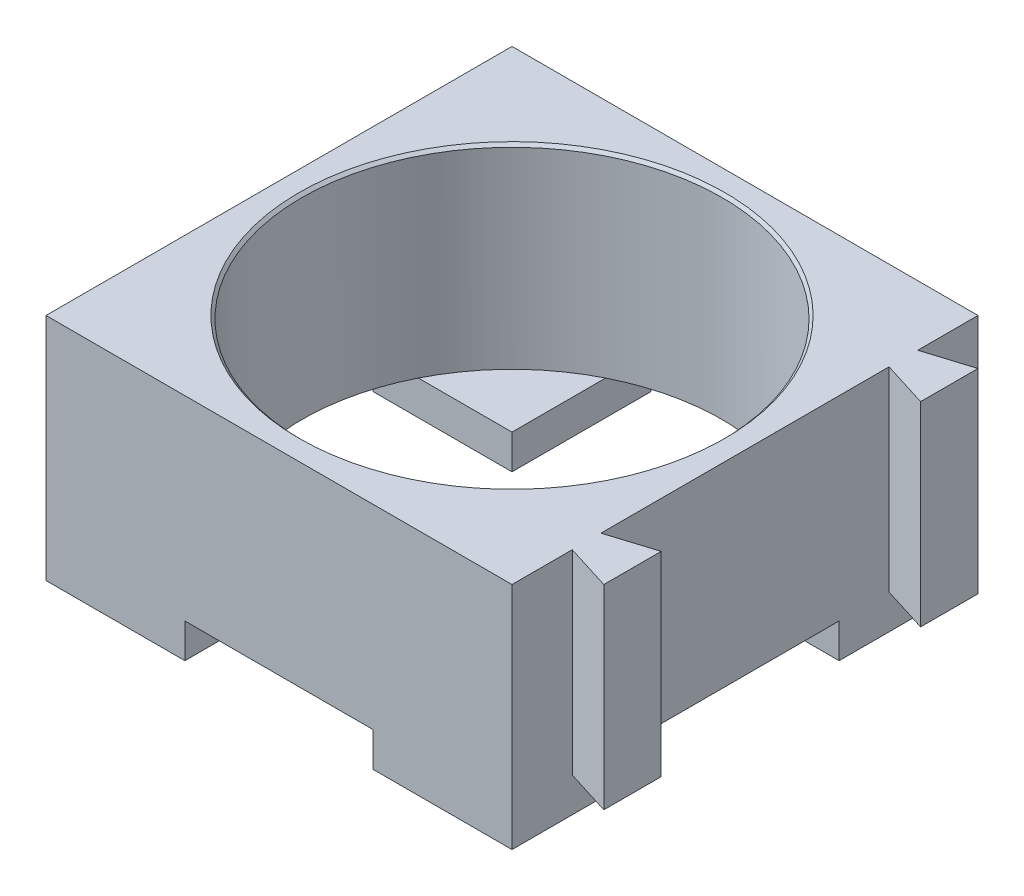
ISO-10303-21;
HEADER;
FILE_DESCRIPTION(('STEP AP214'),'2;1');
FILE_NAME('part.step','',(''),(''),'','','');
FILE_SCHEMA(('AUTOMOTIVE_DESIGN { 1 0 10303 214 1 1 1 1 }'));
ENDSEC;
DATA;
#1=APPLICATION_CONTEXT('core data for automotive mechanical design processes');
#2=APPLICATION_PROTOCOL_DEFINITION('international standard','automotive_design',2000,#1);
#3=PRODUCT_CONTEXT('',#1,'mechanical');
#4=PRODUCT('Part','Part','',(#3));
#5=PRODUCT_RELATED_PRODUCT_CATEGORY('part','',(#4));
#6=PRODUCT_DEFINITION_FORMATION('','',#4);
#7=PRODUCT_DEFINITION_CONTEXT('part definition',#1,'design');
#8=PRODUCT_DEFINITION('design','',#6,#7);
#9=PRODUCT_DEFINITION_SHAPE('','',#8);
#10=(LENGTH_UNIT() NAMED_UNIT(*) SI_UNIT(.MILLI.,.METRE.));
#11=(NAMED_UNIT(*) PLANE_ANGLE_UNIT() SI_UNIT($,.RADIAN.));
#12=(NAMED_UNIT(*) SI_UNIT($,.STERADIAN.) SOLID_ANGLE_UNIT());
#13=UNCERTAINTY_MEASURE_WITH_UNIT(LENGTH_MEASURE(1.E-05),#10,'distance_accuracy_value','');
#14=(GEOMETRIC_REPRESENTATION_CONTEXT(3) GLOBAL_UNCERTAINTY_ASSIGNED_CONTEXT((#13)) GLOBAL_UNIT_ASSIGNED_CONTEXT((#10,
#11,#12)) REPRESENTATION_CONTEXT('',''));
#15=CARTESIAN_POINT('',(0.,0.,0.));
#16=DIRECTION('',(0.,0.,1.));
#17=DIRECTION('',(1.,0.,0.));
#18=AXIS2_PLACEMENT_3D('',#15,#16,#17);
#19=CARTESIAN_POINT('',(0.,0.,0.));
#20=DIRECTION('',(0.,1.,0.));
#21=DIRECTION('',(0.,0.,1.));
#22=AXIS2_PLACEMENT_3D('',#19,#20,#21);
#23=PLANE('',#22);
#24=DIRECTION('',(0.,0.,1.));
#25=VECTOR('',#24,1.);
#26=CARTESIAN_POINT('',(10.15,0.,-10.15));
#27=LINE('',#26,#25);
#28=CARTESIAN_POINT('',(10.15,0.,-7.525));
#29=VERTEX_POINT('',#28);
#30=CARTESIAN_POINT('',(10.15,0.,-6.275));
#31=VERTEX_POINT('',#30);
#32=EDGE_CURVE('E492',#29,#31,#27,.T.);
#33=ORIENTED_EDGE('',*,*,#32,.F.);
#34=DIRECTION('',(-0.954479978035031,0.,0.298274993135942));
#35=VECTOR('',#34,1.);
#36=CARTESIAN_POINT('',(12.15,0.,-8.15));
#37=LINE('',#36,#35);
#38=CARTESIAN_POINT('',(12.15,0.,-8.15));
#39=VERTEX_POINT('',#38);
#40=EDGE_CURVE('E379',#39,#29,#37,.T.);
#41=ORIENTED_EDGE('',*,*,#40,.F.);
#42=DIRECTION('',(0.,0.,-1.));
#43=VECTOR('',#42,1.);
#44=CARTESIAN_POINT('',(12.15,0.,-8.15));
#45=LINE('',#44,#43);
#46=CARTESIAN_POINT('',(12.15,0.,-5.65));
#47=VERTEX_POINT('',#46);
#48=EDGE_CURVE('E377',#47,#39,#45,.T.);
#49=ORIENTED_EDGE('',*,*,#48,.F.);
#50=DIRECTION('',(0.954479978035029,0.,0.298274993135948));
#51=VECTOR('',#50,1.);
#52=CARTESIAN_POINT('',(12.15,0.,-5.65));
#53=LINE('',#52,#51);
#54=EDGE_CURVE('E375',#31,#47,#53,.T.);
#55=ORIENTED_EDGE('',*,*,#54,.F.);
#56=EDGE_LOOP('',(#33,#41,#49,#55));
#57=FACE_BOUND('',#56,.T.);
#58=ADVANCED_FACE('F36',(#57),#23,.F.);
#59=DIRECTION('',(-1.,0.,0.));
#60=VECTOR('',#59,1.);
#61=CARTESIAN_POINT('',(10.15,0.,-4.1));
#62=LINE('',#61,#60);
#63=CARTESIAN_POINT('',(10.15,0.,-4.1));
#64=VERTEX_POINT('',#63);
#65=CARTESIAN_POINT('',(8.18000611246715,0.,-4.1));
#66=VERTEX_POINT('',#65);
#67=EDGE_CURVE('E51',#64,#66,#62,.T.);
#68=ORIENTED_EDGE('',*,*,#67,.F.);
#69=DIRECTION('',(0.,0.,-1.));
#70=VECTOR('',#69,1.);
#71=CARTESIAN_POINT('',(10.15,0.,-6.275));
#72=LINE('',#71,#70);
#73=CARTESIAN_POINT('',(10.15,0.,4.1));
#74=VERTEX_POINT('',#73);
#75=EDGE_CURVE('E247',#74,#64,#72,.T.);
#76=ORIENTED_EDGE('',*,*,#75,.F.);
#77=DIRECTION('',(1.,0.,0.));
#78=VECTOR('',#77,1.);
#79=CARTESIAN_POINT('',(10.15,0.,4.1));
#80=LINE('',#79,#78);
#81=CARTESIAN_POINT('',(8.18000611246715,0.,4.1));
#82=VERTEX_POINT('',#81);
#83=EDGE_CURVE('E271',#82,#74,#80,.T.);
#84=ORIENTED_EDGE('',*,*,#83,.F.);
#85=CARTESIAN_POINT('',(0.,0.,0.));
#86=DIRECTION('',(0.,1.,0.));
#87=DIRECTION('',(0.,0.,1.));
#88=AXIS2_PLACEMENT_3D('',#85,#86,#87);
#89=CIRCLE('',#88,9.14999999999999);
#90=EDGE_CURVE('E456',#82,#66,#89,.T.);
#91=ORIENTED_EDGE('',*,*,#90,.T.);
#92=EDGE_LOOP('',(#68,#76,#84,#91));
#93=FACE_BOUND('',#92,.T.);
#94=ADVANCED_FACE('F488',(#93),#23,.F.);
#95=DIRECTION('',(0.,0.,-1.));
#96=VECTOR('',#95,1.);
#97=CARTESIAN_POINT('',(4.1,0.,-10.15));
#98=LINE('',#97,#96);
#99=CARTESIAN_POINT('',(4.1,0.,-8.18000611246714));
#100=VERTEX_POINT('',#99);
#101=CARTESIAN_POINT('',(4.1,0.,-10.15));
#102=VERTEX_POINT('',#101);
#103=EDGE_CURVE('E481',#100,#102,#98,.T.);
#104=ORIENTED_EDGE('',*,*,#103,.F.);
#105=CARTESIAN_POINT('',(-4.1,0.,-8.18000611246715));
#106=VERTEX_POINT('',#105);
#107=EDGE_CURVE('E340',#100,#106,#89,.T.);
#108=ORIENTED_EDGE('',*,*,#107,.T.);
#109=DIRECTION('',(0.,0.,1.));
#110=VECTOR('',#109,1.);
#111=CARTESIAN_POINT('',(-4.1,0.,-10.15));
#112=LINE('',#111,#110);
#113=CARTESIAN_POINT('',(-4.1,0.,-10.15));
#114=VERTEX_POINT('',#113);
#115=EDGE_CURVE('E293',#114,#106,#112,.T.);
#116=ORIENTED_EDGE('',*,*,#115,.F.);
#117=DIRECTION('',(-1.,0.,0.));
#118=VECTOR('',#117,1.);
#119=CARTESIAN_POINT('',(-10.15,0.,-10.15));
#120=LINE('',#119,#118);
#121=EDGE_CURVE('E59',#102,#114,#120,.T.);
#122=ORIENTED_EDGE('',*,*,#121,.F.);
#123=EDGE_LOOP('',(#104,#108,#116,#122));
#124=FACE_BOUND('',#123,.T.);
#125=ADVANCED_FACE('F480',(#124),#23,.F.);
#126=DIRECTION('',(0.,0.,1.));
#127=VECTOR('',#126,1.);
#128=CARTESIAN_POINT('',(10.15,0.,10.15));
#129=LINE('',#128,#127);
#130=CARTESIAN_POINT('',(10.15,0.,6.275));
#131=VERTEX_POINT('',#130);
#132=CARTESIAN_POINT('',(10.15,0.,7.525));
#133=VERTEX_POINT('',#132);
#134=EDGE_CURVE('E248',#131,#133,#129,.T.);
#135=ORIENTED_EDGE('',*,*,#134,.F.);
#136=DIRECTION('',(-0.954479978035036,0.,0.298274993135925));
#137=VECTOR('',#136,1.);
#138=CARTESIAN_POINT('',(12.1500000000001,0.,5.65));
#139=LINE('',#138,#137);
#140=CARTESIAN_POINT('',(12.1500000000001,0.,5.65));
#141=VERTEX_POINT('',#140);
#142=EDGE_CURVE('E371',#141,#131,#139,.T.);
#143=ORIENTED_EDGE('',*,*,#142,.F.);
#144=DIRECTION('',(0.,0.,-1.));
#145=VECTOR('',#144,1.);
#146=CARTESIAN_POINT('',(12.1500000000001,0.,5.65));
#147=LINE('',#146,#145);
#148=CARTESIAN_POINT('',(12.15,0.,8.15000000000001));
#149=VERTEX_POINT('',#148);
#150=EDGE_CURVE('E369',#149,#141,#147,.T.);
#151=ORIENTED_EDGE('',*,*,#150,.F.);
#152=DIRECTION('',(0.954479978035028,0.,0.298274993135951));
#153=VECTOR('',#152,1.);
#154=CARTESIAN_POINT('',(12.15,0.,8.15000000000001));
#155=LINE('',#154,#153);
#156=EDGE_CURVE('E338',#133,#149,#155,.T.);
#157=ORIENTED_EDGE('',*,*,#156,.F.);
#158=EDGE_LOOP('',(#135,#143,#151,#157));
#159=FACE_BOUND('',#158,.T.);
#160=ADVANCED_FACE('F535',(#159),#23,.F.);
#161=DIRECTION('',(0.,0.,-1.));
#162=VECTOR('',#161,1.);
#163=CARTESIAN_POINT('',(4.1,0.,10.15));
#164=LINE('',#163,#162);
#165=CARTESIAN_POINT('',(4.1,0.,10.15));
#166=VERTEX_POINT('',#165);
#167=CARTESIAN_POINT('',(4.1,0.,8.18000611246715));
#168=VERTEX_POINT('',#167);
#169=EDGE_CURVE('E268',#166,#168,#164,.T.);
#170=ORIENTED_EDGE('',*,*,#169,.F.);
#171=DIRECTION('',(1.,0.,0.));
#172=VECTOR('',#171,1.);
#173=CARTESIAN_POINT('',(-10.15,0.,10.15));
#174=LINE('',#173,#172);
#175=CARTESIAN_POINT('',(-4.1,0.,10.15));
#176=VERTEX_POINT('',#175);
#177=EDGE_CURVE('E345',#176,#166,#174,.T.);
#178=ORIENTED_EDGE('',*,*,#177,.F.);
#179=DIRECTION('',(0.,0.,1.));
#180=VECTOR('',#179,1.);
#181=CARTESIAN_POINT('',(-4.1,0.,10.15));
#182=LINE('',#181,#180);
#183=CARTESIAN_POINT('',(-4.1,0.,8.18000611246714));
#184=VERTEX_POINT('',#183);
#185=EDGE_CURVE('E325',#184,#176,#182,.T.);
#186=ORIENTED_EDGE('',*,*,#185,.F.);
#187=EDGE_CURVE('E339',#184,#168,#89,.T.);
#188=ORIENTED_EDGE('',*,*,#187,.T.);
#189=EDGE_LOOP('',(#170,#178,#186,#188));
#190=FACE_BOUND('',#189,.T.);
#191=ADVANCED_FACE('F556',(#190),#23,.F.);
#192=DIRECTION('',(-1.,0.,0.));
#193=VECTOR('',#192,1.);
#194=CARTESIAN_POINT('',(-10.15,0.,-4.1));
#195=LINE('',#194,#193);
#196=CARTESIAN_POINT('',(-8.18000611246715,0.,-4.1));
#197=VERTEX_POINT('',#196);
#198=CARTESIAN_POINT('',(-10.15,0.,-4.1));
#199=VERTEX_POINT('',#198);
#200=EDGE_CURVE('E296',#197,#199,#195,.T.);
#201=ORIENTED_EDGE('',*,*,#200,.F.);
#202=CARTESIAN_POINT('',(-8.18000611246715,0.,4.1));
#203=VERTEX_POINT('',#202);
#204=EDGE_CURVE('E334',#197,#203,#89,.T.);
#205=ORIENTED_EDGE('',*,*,#204,.T.);
#206=DIRECTION('',(1.,0.,0.));
#207=VECTOR('',#206,1.);
#208=CARTESIAN_POINT('',(-10.15,0.,4.1));
#209=LINE('',#208,#207);
#210=CARTESIAN_POINT('',(-10.15,0.,4.1));
#211=VERTEX_POINT('',#210);
#212=EDGE_CURVE('E320',#211,#203,#209,.T.);
#213=ORIENTED_EDGE('',*,*,#212,.F.);
#214=DIRECTION('',(0.,0.,1.));
#215=VECTOR('',#214,1.);
#216=CARTESIAN_POINT('',(-10.15,0.,-10.15));
#217=LINE('',#216,#215);
#218=EDGE_CURVE('E383',#199,#211,#217,.T.);
#219=ORIENTED_EDGE('',*,*,#218,.F.);
#220=EDGE_LOOP('',(#201,#205,#213,#219));
#221=FACE_BOUND('',#220,.T.);
#222=ADVANCED_FACE('F463',(#221),#23,.F.);
#223=CARTESIAN_POINT('',(0.,8.5,0.));
#224=DIRECTION('',(0.,1.,0.));
#225=DIRECTION('',(0.,0.,1.));
#226=AXIS2_PLACEMENT_3D('',#223,#224,#225);
#227=PLANE('',#226);
#228=CARTESIAN_POINT('',(0.,8.5,0.));
#229=DIRECTION('',(0.,1.,0.));
#230=DIRECTION('',(0.,0.,1.));
#231=AXIS2_PLACEMENT_3D('',#228,#229,#230);
#232=CIRCLE('',#231,9.275);
#233=CARTESIAN_POINT('',(0.,8.5,9.275));
#234=VERTEX_POINT('',#233);
#235=EDGE_CURVE('E11',#234,#234,#232,.F.);
#236=ORIENTED_EDGE('',*,*,#235,.T.);
#237=EDGE_LOOP('',(#236));
#238=FACE_BOUND('',#237,.T.);
#239=DIRECTION('',(0.,0.,-1.));
#240=VECTOR('',#239,1.);
#241=CARTESIAN_POINT('',(10.15,8.5,7.525));
#242=LINE('',#241,#240);
#243=CARTESIAN_POINT('',(10.15,8.5,10.15));
#244=VERTEX_POINT('',#243);
#245=CARTESIAN_POINT('',(10.15,8.5,7.525));
#246=VERTEX_POINT('',#245);
#247=EDGE_CURVE('E341',#244,#246,#242,.T.);
#248=ORIENTED_EDGE('',*,*,#247,.T.);
#249=DIRECTION('',(0.954479978035028,0.,0.298274993135951));
#250=VECTOR('',#249,1.);
#251=CARTESIAN_POINT('',(12.15,8.5,8.15000000000001));
#252=LINE('',#251,#250);
#253=CARTESIAN_POINT('',(12.15,8.5,8.15000000000001));
#254=VERTEX_POINT('',#253);
#255=EDGE_CURVE('E344',#246,#254,#252,.T.);
#256=ORIENTED_EDGE('',*,*,#255,.T.);
#257=DIRECTION('',(0.,0.,-1.));
#258=VECTOR('',#257,1.);
#259=CARTESIAN_POINT('',(12.1500000000001,8.5,5.65));
#260=LINE('',#259,#258);
#261=CARTESIAN_POINT('',(12.1500000000001,8.5,5.65));
#262=VERTEX_POINT('',#261);
#263=EDGE_CURVE('E347',#254,#262,#260,.T.);
#264=ORIENTED_EDGE('',*,*,#263,.T.);
#265=DIRECTION('',(-0.954479978035036,0.,0.298274993135925));
#266=VECTOR('',#265,1.);
#267=CARTESIAN_POINT('',(12.1500000000001,8.5,5.65));
#268=LINE('',#267,#266);
#269=CARTESIAN_POINT('',(10.15,8.5,6.275));
#270=VERTEX_POINT('',#269);
#271=EDGE_CURVE('E349',#262,#270,#268,.T.);
#272=ORIENTED_EDGE('',*,*,#271,.T.);
#273=DIRECTION('',(0.,0.,-1.));
#274=VECTOR('',#273,1.);
#275=CARTESIAN_POINT('',(10.15,8.5,-6.275));
#276=LINE('',#275,#274);
#277=CARTESIAN_POINT('',(10.15,8.5,-6.275));
#278=VERTEX_POINT('',#277);
#279=EDGE_CURVE('E351',#270,#278,#276,.T.);
#280=ORIENTED_EDGE('',*,*,#279,.T.);
#281=DIRECTION('',(0.954479978035029,0.,0.298274993135948));
#282=VECTOR('',#281,1.);
#283=CARTESIAN_POINT('',(12.15,8.5,-5.65));
#284=LINE('',#283,#282);
#285=CARTESIAN_POINT('',(12.15,8.5,-5.65));
#286=VERTEX_POINT('',#285);
#287=EDGE_CURVE('E353',#278,#286,#284,.T.);
#288=ORIENTED_EDGE('',*,*,#287,.T.);
#289=DIRECTION('',(0.,0.,-1.));
#290=VECTOR('',#289,1.);
#291=CARTESIAN_POINT('',(12.15,8.5,-8.15));
#292=LINE('',#291,#290);
#293=CARTESIAN_POINT('',(12.15,8.5,-8.15));
#294=VERTEX_POINT('',#293);
#295=EDGE_CURVE('E355',#286,#294,#292,.T.);
#296=ORIENTED_EDGE('',*,*,#295,.T.);
#297=DIRECTION('',(-0.954479978035031,0.,0.298274993135942));
#298=VECTOR('',#297,1.);
#299=CARTESIAN_POINT('',(12.15,8.5,-8.15));
#300=LINE('',#299,#298);
#301=CARTESIAN_POINT('',(10.15,8.5,-7.525));
#302=VERTEX_POINT('',#301);
#303=EDGE_CURVE('E357',#294,#302,#300,.T.);
#304=ORIENTED_EDGE('',*,*,#303,.T.);
#305=DIRECTION('',(0.,0.,-1.));
#306=VECTOR('',#305,1.);
#307=CARTESIAN_POINT('',(10.15,8.5,-10.15));
#308=LINE('',#307,#306);
#309=CARTESIAN_POINT('',(10.15,8.5,-10.15));
#310=VERTEX_POINT('',#309);
#311=EDGE_CURVE('E359',#302,#310,#308,.T.);
#312=ORIENTED_EDGE('',*,*,#311,.T.);
#313=DIRECTION('',(-1.,0.,0.));
#314=VECTOR('',#313,1.);
#315=CARTESIAN_POINT('',(-10.15,8.5,-10.15));
#316=LINE('',#315,#314);
#317=CARTESIAN_POINT('',(-10.15,8.5,-10.15));
#318=VERTEX_POINT('',#317);
#319=EDGE_CURVE('E361',#310,#318,#316,.T.);
#320=ORIENTED_EDGE('',*,*,#319,.T.);
#321=DIRECTION('',(0.,0.,1.));
#322=VECTOR('',#321,1.);
#323=CARTESIAN_POINT('',(-10.15,8.5,-10.15));
#324=LINE('',#323,#322);
#325=CARTESIAN_POINT('',(-10.15,8.5,10.15));
#326=VERTEX_POINT('',#325);
#327=EDGE_CURVE('E363',#318,#326,#324,.T.);
#328=ORIENTED_EDGE('',*,*,#327,.T.);
#329=DIRECTION('',(1.,0.,0.));
#330=VECTOR('',#329,1.);
#331=CARTESIAN_POINT('',(-10.15,8.5,10.15));
#332=LINE('',#331,#330);
#333=EDGE_CURVE('E365',#326,#244,#332,.T.);
#334=ORIENTED_EDGE('',*,*,#333,.T.);
#335=EDGE_LOOP('',(#248,#256,#264,#272,#280,#288,#296,#304,#312,#320,#328,#334));
#336=FACE_BOUND('',#335,.T.);
#337=ADVANCED_FACE('F509',(#238,#336),#227,.T.);
#338=CARTESIAN_POINT('',(12.15,8.5,8.15000000000001));
#339=DIRECTION('',(0.298274993135951,0.,-0.954479978035029));
#340=DIRECTION('',(-0.954479978035029,0.,-0.298274993135951));
#341=AXIS2_PLACEMENT_3D('',#338,#339,#340);
#342=PLANE('',#341);
#343=ORIENTED_EDGE('',*,*,#156,.T.);
#344=DIRECTION('',(0.,-1.,0.));
#345=VECTOR('',#344,1.);
#346=CARTESIAN_POINT('',(12.15,8.5,8.15000000000001));
#347=LINE('',#346,#345);
#348=EDGE_CURVE('E410',#254,#149,#347,.T.);
#349=ORIENTED_EDGE('',*,*,#348,.F.);
#350=ORIENTED_EDGE('',*,*,#255,.F.);
#351=DIRECTION('',(0.,-1.,0.));
#352=VECTOR('',#351,1.);
#353=CARTESIAN_POINT('',(10.15,8.5,7.525));
#354=LINE('',#353,#352);
#355=EDGE_CURVE('E413',#246,#133,#354,.T.);
#356=ORIENTED_EDGE('',*,*,#355,.T.);
#357=EDGE_LOOP('',(#343,#349,#350,#356));
#358=FACE_BOUND('',#357,.T.);
#359=ADVANCED_FACE('F539',(#358),#342,.F.);
#360=CARTESIAN_POINT('',(12.1500000000001,8.5,5.65));
#361=DIRECTION('',(-1.,0.,0.));
#362=DIRECTION('',(0.,0.,1.));
#363=AXIS2_PLACEMENT_3D('',#360,#361,#362);
#364=PLANE('',#363);
#365=ORIENTED_EDGE('',*,*,#150,.T.);
#366=DIRECTION('',(0.,-1.,0.));
#367=VECTOR('',#366,1.);
#368=CARTESIAN_POINT('',(12.1500000000001,8.5,5.65));
#369=LINE('',#368,#367);
#370=EDGE_CURVE('E407',#262,#141,#369,.T.);
#371=ORIENTED_EDGE('',*,*,#370,.F.);
#372=ORIENTED_EDGE('',*,*,#263,.F.);
#373=ORIENTED_EDGE('',*,*,#348,.T.);
#374=EDGE_LOOP('',(#365,#371,#372,#373));
#375=FACE_BOUND('',#374,.T.);
#376=ADVANCED_FACE('F601',(#375),#364,.F.);
#377=CARTESIAN_POINT('',(12.1500000000001,8.5,5.65));
#378=DIRECTION('',(0.298274993135925,0.,0.954479978035037));
#379=DIRECTION('',(0.954479978035037,0.,-0.298274993135925));
#380=AXIS2_PLACEMENT_3D('',#377,#378,#379);
#381=PLANE('',#380);
#382=ORIENTED_EDGE('',*,*,#142,.T.);
#383=DIRECTION('',(0.,-1.,0.));
#384=VECTOR('',#383,1.);
#385=CARTESIAN_POINT('',(10.15,8.5,6.275));
#386=LINE('',#385,#384);
#387=EDGE_CURVE('E404',#270,#131,#386,.T.);
#388=ORIENTED_EDGE('',*,*,#387,.F.);
#389=ORIENTED_EDGE('',*,*,#271,.F.);
#390=ORIENTED_EDGE('',*,*,#370,.T.);
#391=EDGE_LOOP('',(#382,#388,#389,#390));
#392=FACE_BOUND('',#391,.T.);
#393=ADVANCED_FACE('F530',(#392),#381,.F.);
#394=CARTESIAN_POINT('',(12.15,8.5,-5.65));
#395=DIRECTION('',(0.298274993135948,0.,-0.954479978035029));
#396=DIRECTION('',(-0.954479978035029,0.,-0.298274993135948));
#397=AXIS2_PLACEMENT_3D('',#394,#395,#396);
#398=PLANE('',#397);
#399=ORIENTED_EDGE('',*,*,#54,.T.);
#400=DIRECTION('',(0.,-1.,0.));
#401=VECTOR('',#400,1.);
#402=CARTESIAN_POINT('',(12.15,8.5,-5.65));
#403=LINE('',#402,#401);
#404=EDGE_CURVE('E399',#286,#47,#403,.T.);
#405=ORIENTED_EDGE('',*,*,#404,.F.);
#406=ORIENTED_EDGE('',*,*,#287,.F.);
#407=DIRECTION('',(0.,-1.,0.));
#408=VECTOR('',#407,1.);
#409=CARTESIAN_POINT('',(10.15,8.5,-6.275));
#410=LINE('',#409,#408);
#411=EDGE_CURVE('E402',#278,#31,#410,.T.);
#412=ORIENTED_EDGE('',*,*,#411,.T.);
#413=EDGE_LOOP('',(#399,#405,#406,#412));
#414=FACE_BOUND('',#413,.T.);
#415=ADVANCED_FACE('F524',(#414),#398,.F.);
#416=CARTESIAN_POINT('',(12.15,8.5,-8.15));
#417=DIRECTION('',(-1.,0.,0.));
#418=DIRECTION('',(0.,0.,1.));
#419=AXIS2_PLACEMENT_3D('',#416,#417,#418);
#420=PLANE('',#419);
#421=ORIENTED_EDGE('',*,*,#48,.T.);
#422=DIRECTION('',(0.,-1.,0.));
#423=VECTOR('',#422,1.);
#424=CARTESIAN_POINT('',(12.15,8.5,-8.15));
#425=LINE('',#424,#423);
#426=EDGE_CURVE('E396',#294,#39,#425,.T.);
#427=ORIENTED_EDGE('',*,*,#426,.F.);
#428=ORIENTED_EDGE('',*,*,#295,.F.);
#429=ORIENTED_EDGE('',*,*,#404,.T.);
#430=EDGE_LOOP('',(#421,#427,#428,#429));
#431=FACE_BOUND('',#430,.T.);
#432=ADVANCED_FACE('F620',(#431),#420,.F.);
#433=CARTESIAN_POINT('',(12.15,8.5,-8.15));
#434=DIRECTION('',(0.298274993135942,0.,0.954479978035031));
#435=DIRECTION('',(0.954479978035031,0.,-0.298274993135942));
#436=AXIS2_PLACEMENT_3D('',#433,#434,#435);
#437=PLANE('',#436);
#438=ORIENTED_EDGE('',*,*,#40,.T.);
#439=DIRECTION('',(0.,-1.,0.));
#440=VECTOR('',#439,1.);
#441=CARTESIAN_POINT('',(10.15,8.5,-7.525));
#442=LINE('',#441,#440);
#443=EDGE_CURVE('E394',#302,#29,#442,.T.);
#444=ORIENTED_EDGE('',*,*,#443,.F.);
#445=ORIENTED_EDGE('',*,*,#303,.F.);
#446=ORIENTED_EDGE('',*,*,#426,.T.);
#447=EDGE_LOOP('',(#438,#444,#445,#446));
#448=FACE_BOUND('',#447,.T.);
#449=ADVANCED_FACE('F514',(#448),#437,.F.);
#450=CARTESIAN_POINT('',(10.15,8.5,-10.15));
#451=DIRECTION('',(-1.,0.,0.));
#452=DIRECTION('',(0.,0.,1.));
#453=AXIS2_PLACEMENT_3D('',#450,#451,#452);
#454=PLANE('',#453);
#455=ORIENTED_EDGE('',*,*,#443,.T.);
#456=ORIENTED_EDGE('',*,*,#32,.T.);
#457=ORIENTED_EDGE('',*,*,#411,.F.);
#458=ORIENTED_EDGE('',*,*,#279,.F.);
#459=ORIENTED_EDGE('',*,*,#387,.T.);
#460=ORIENTED_EDGE('',*,*,#134,.T.);
#461=ORIENTED_EDGE('',*,*,#355,.F.);
#462=ORIENTED_EDGE('',*,*,#247,.F.);
#463=DIRECTION('',(0.,-1.,0.));
#464=VECTOR('',#463,1.);
#465=CARTESIAN_POINT('',(10.15,8.5,10.15));
#466=LINE('',#465,#464);
#467=CARTESIAN_POINT('',(10.15,-1.5,10.15));
#468=VERTEX_POINT('',#467);
#469=EDGE_CURVE('E367',#244,#468,#466,.T.);
#470=ORIENTED_EDGE('',*,*,#469,.T.);
#471=DIRECTION('',(0.,0.,1.));
#472=VECTOR('',#471,1.);
#473=CARTESIAN_POINT('',(10.15,-1.5,10.15));
#474=LINE('',#473,#472);
#475=CARTESIAN_POINT('',(10.15,-1.5,4.1));
#476=VERTEX_POINT('',#475);
#477=EDGE_CURVE('E257',#476,#468,#474,.T.);
#478=ORIENTED_EDGE('',*,*,#477,.F.);
#479=DIRECTION('',(0.,1.,0.));
#480=VECTOR('',#479,1.);
#481=CARTESIAN_POINT('',(10.15,-1.5,4.1));
#482=LINE('',#481,#480);
#483=EDGE_CURVE('E266',#476,#74,#482,.T.);
#484=ORIENTED_EDGE('',*,*,#483,.T.);
#485=ORIENTED_EDGE('',*,*,#75,.T.);
#486=DIRECTION('',(0.,1.,0.));
#487=VECTOR('',#486,1.);
#488=CARTESIAN_POINT('',(10.15,-1.5,-4.1));
#489=LINE('',#488,#487);
#490=CARTESIAN_POINT('',(10.15,-1.5,-4.1));
#491=VERTEX_POINT('',#490);
#492=EDGE_CURVE('E227',#491,#64,#489,.T.);
#493=ORIENTED_EDGE('',*,*,#492,.F.);
#494=DIRECTION('',(0.,0.,1.));
#495=VECTOR('',#494,1.);
#496=CARTESIAN_POINT('',(10.15,-1.5,-10.15));
#497=LINE('',#496,#495);
#498=CARTESIAN_POINT('',(10.15,-1.5,-10.15));
#499=VERTEX_POINT('',#498);
#500=EDGE_CURVE('E233',#499,#491,#497,.T.);
#501=ORIENTED_EDGE('',*,*,#500,.F.);
#502=DIRECTION('',(0.,-1.,0.));
#503=VECTOR('',#502,1.);
#504=CARTESIAN_POINT('',(10.15,8.5,-10.15));
#505=LINE('',#504,#503);
#506=EDGE_CURVE('E392',#310,#499,#505,.T.);
#507=ORIENTED_EDGE('',*,*,#506,.F.);
#508=ORIENTED_EDGE('',*,*,#311,.F.);
#509=EDGE_LOOP('',(#455,#456,#457,#458,#459,#460,#461,#462,#470,#478,#484,#485,#493,#501,#507,#508));
#510=FACE_BOUND('',#509,.T.);
#511=ADVANCED_FACE('F245',(#510),#454,.F.);
#512=CARTESIAN_POINT('',(-10.15,8.5,-10.15));
#513=DIRECTION('',(0.,0.,1.));
#514=DIRECTION('',(1.,0.,0.));
#515=AXIS2_PLACEMENT_3D('',#512,#513,#514);
#516=PLANE('',#515);
#517=ORIENTED_EDGE('',*,*,#506,.T.);
#518=DIRECTION('',(1.,0.,0.));
#519=VECTOR('',#518,1.);
#520=CARTESIAN_POINT('',(10.15,-1.5,-10.15));
#521=LINE('',#520,#519);
#522=CARTESIAN_POINT('',(4.1,-1.5,-10.15));
#523=VERTEX_POINT('',#522);
#524=EDGE_CURVE('E239',#523,#499,#521,.T.);
#525=ORIENTED_EDGE('',*,*,#524,.F.);
#526=DIRECTION('',(0.,1.,0.));
#527=VECTOR('',#526,1.);
#528=CARTESIAN_POINT('',(4.1,-1.5,-10.15));
#529=LINE('',#528,#527);
#530=EDGE_CURVE('E253',#523,#102,#529,.T.);
#531=ORIENTED_EDGE('',*,*,#530,.T.);
#532=ORIENTED_EDGE('',*,*,#121,.T.);
#533=DIRECTION('',(0.,1.,0.));
#534=VECTOR('',#533,1.);
#535=CARTESIAN_POINT('',(-4.1,-1.5,-10.15));
#536=LINE('',#535,#534);
#537=CARTESIAN_POINT('',(-4.1,-1.5,-10.15));
#538=VERTEX_POINT('',#537);
#539=EDGE_CURVE('E304',#538,#114,#536,.T.);
#540=ORIENTED_EDGE('',*,*,#539,.F.);
#541=DIRECTION('',(1.,0.,0.));
#542=VECTOR('',#541,1.);
#543=CARTESIAN_POINT('',(-10.15,-1.5,-10.15));
#544=LINE('',#543,#542);
#545=CARTESIAN_POINT('',(-10.15,-1.5,-10.15));
#546=VERTEX_POINT('',#545);
#547=EDGE_CURVE('E285',#546,#538,#544,.T.);
#548=ORIENTED_EDGE('',*,*,#547,.F.);
#549=DIRECTION('',(0.,-1.,0.));
#550=VECTOR('',#549,1.);
#551=CARTESIAN_POINT('',(-10.15,8.5,-10.15));
#552=LINE('',#551,#550);
#553=EDGE_CURVE('E390',#318,#546,#552,.T.);
#554=ORIENTED_EDGE('',*,*,#553,.F.);
#555=ORIENTED_EDGE('',*,*,#319,.F.);
#556=EDGE_LOOP('',(#517,#525,#531,#532,#540,#548,#554,#555));
#557=FACE_BOUND('',#556,.T.);
#558=ADVANCED_FACE('F503',(#557),#516,.F.);
#559=CARTESIAN_POINT('',(-10.15,8.5,-10.15));
#560=DIRECTION('',(1.,0.,0.));
#561=DIRECTION('',(0.,0.,-1.));
#562=AXIS2_PLACEMENT_3D('',#559,#560,#561);
#563=PLANE('',#562);
#564=ORIENTED_EDGE('',*,*,#553,.T.);
#565=DIRECTION('',(0.,0.,-1.));
#566=VECTOR('',#565,1.);
#567=CARTESIAN_POINT('',(-10.15,-1.5,-10.15));
#568=LINE('',#567,#566);
#569=CARTESIAN_POINT('',(-10.15,-1.5,-4.1));
#570=VERTEX_POINT('',#569);
#571=EDGE_CURVE('E282',#570,#546,#568,.T.);
#572=ORIENTED_EDGE('',*,*,#571,.F.);
#573=DIRECTION('',(0.,1.,0.));
#574=VECTOR('',#573,1.);
#575=CARTESIAN_POINT('',(-10.15,-1.5,-4.1));
#576=LINE('',#575,#574);
#577=EDGE_CURVE('E292',#570,#199,#576,.T.);
#578=ORIENTED_EDGE('',*,*,#577,.T.);
#579=ORIENTED_EDGE('',*,*,#218,.T.);
#580=DIRECTION('',(0.,1.,0.));
#581=VECTOR('',#580,1.);
#582=CARTESIAN_POINT('',(-10.15,-1.5,4.1));
#583=LINE('',#582,#581);
#584=CARTESIAN_POINT('',(-10.15,-1.5,4.1));
#585=VERTEX_POINT('',#584);
#586=EDGE_CURVE('E331',#585,#211,#583,.T.);
#587=ORIENTED_EDGE('',*,*,#586,.F.);
#588=DIRECTION('',(0.,0.,-1.));
#589=VECTOR('',#588,1.);
#590=CARTESIAN_POINT('',(-10.15,-1.5,10.15));
#591=LINE('',#590,#589);
#592=CARTESIAN_POINT('',(-10.15,-1.5,10.15));
#593=VERTEX_POINT('',#592);
#594=EDGE_CURVE('E308',#593,#585,#591,.T.);
#595=ORIENTED_EDGE('',*,*,#594,.F.);
#596=DIRECTION('',(0.,-1.,0.));
#597=VECTOR('',#596,1.);
#598=CARTESIAN_POINT('',(-10.15,8.5,10.15));
#599=LINE('',#598,#597);
#600=EDGE_CURVE('E388',#326,#593,#599,.T.);
#601=ORIENTED_EDGE('',*,*,#600,.F.);
#602=ORIENTED_EDGE('',*,*,#327,.F.);
#603=EDGE_LOOP('',(#564,#572,#578,#579,#587,#595,#601,#602));
#604=FACE_BOUND('',#603,.T.);
#605=ADVANCED_FACE('F438',(#604),#563,.F.);
#606=CARTESIAN_POINT('',(-10.15,8.5,10.15));
#607=DIRECTION('',(0.,0.,-1.));
#608=DIRECTION('',(-1.,0.,0.));
#609=AXIS2_PLACEMENT_3D('',#606,#607,#608);
#610=PLANE('',#609);
#611=ORIENTED_EDGE('',*,*,#600,.T.);
#612=DIRECTION('',(-1.,0.,0.));
#613=VECTOR('',#612,1.);
#614=CARTESIAN_POINT('',(-10.15,-1.5,10.15));
#615=LINE('',#614,#613);
#616=CARTESIAN_POINT('',(-4.1,-1.5,10.15));
#617=VERTEX_POINT('',#616);
#618=EDGE_CURVE('E316',#617,#593,#615,.T.);
#619=ORIENTED_EDGE('',*,*,#618,.F.);
#620=DIRECTION('',(0.,1.,0.));
#621=VECTOR('',#620,1.);
#622=CARTESIAN_POINT('',(-4.1,-1.5,10.15));
#623=LINE('',#622,#621);
#624=EDGE_CURVE('E319',#617,#176,#623,.T.);
#625=ORIENTED_EDGE('',*,*,#624,.T.);
#626=ORIENTED_EDGE('',*,*,#177,.T.);
#627=DIRECTION('',(0.,1.,0.));
#628=VECTOR('',#627,1.);
#629=CARTESIAN_POINT('',(4.1,-1.5,10.15));
#630=LINE('',#629,#628);
#631=CARTESIAN_POINT('',(4.1,-1.5,10.15));
#632=VERTEX_POINT('',#631);
#633=EDGE_CURVE('E278',#632,#166,#630,.T.);
#634=ORIENTED_EDGE('',*,*,#633,.F.);
#635=DIRECTION('',(-1.,0.,0.));
#636=VECTOR('',#635,1.);
#637=CARTESIAN_POINT('',(10.15,-1.5,10.15));
#638=LINE('',#637,#636);
#639=EDGE_CURVE('E260',#468,#632,#638,.T.);
#640=ORIENTED_EDGE('',*,*,#639,.F.);
#641=ORIENTED_EDGE('',*,*,#469,.F.);
#642=ORIENTED_EDGE('',*,*,#333,.F.);
#643=EDGE_LOOP('',(#611,#619,#625,#626,#634,#640,#641,#642));
#644=FACE_BOUND('',#643,.T.);
#645=ADVANCED_FACE('F429',(#644),#610,.F.);
#646=CARTESIAN_POINT('',(0.,8.5,0.));
#647=DIRECTION('',(0.,-1.,0.));
#648=DIRECTION('',(0.,0.,-1.));
#649=AXIS2_PLACEMENT_3D('',#646,#647,#648);
#650=CYLINDRICAL_SURFACE('',#649,9.14999999999999);
#651=CARTESIAN_POINT('',(0.,8.37499999999999,0.));
#652=DIRECTION('',(0.,1.,0.));
#653=DIRECTION('',(0.,0.,1.));
#654=AXIS2_PLACEMENT_3D('',#651,#652,#653);
#655=CIRCLE('',#654,9.14999999999999);
#656=CARTESIAN_POINT('',(0.,8.37499999999999,9.14999999999999));
#657=VERTEX_POINT('',#656);
#658=EDGE_CURVE('E44',#657,#657,#655,.T.);
#659=ORIENTED_EDGE('',*,*,#658,.T.);
#660=EDGE_LOOP('',(#659));
#661=FACE_BOUND('',#660,.T.);
#662=EDGE_CURVE('E335',#203,#184,#89,.T.);
#663=ORIENTED_EDGE('',*,*,#662,.F.);
#664=ORIENTED_EDGE('',*,*,#204,.F.);
#665=EDGE_CURVE('E455',#106,#197,#89,.T.);
#666=ORIENTED_EDGE('',*,*,#665,.F.);
#667=ORIENTED_EDGE('',*,*,#107,.F.);
#668=EDGE_CURVE('E461',#66,#100,#89,.T.);
#669=ORIENTED_EDGE('',*,*,#668,.F.);
#670=ORIENTED_EDGE('',*,*,#90,.F.);
#671=EDGE_CURVE('E453',#168,#82,#89,.T.);
#672=ORIENTED_EDGE('',*,*,#671,.F.);
#673=ORIENTED_EDGE('',*,*,#187,.F.);
#674=EDGE_LOOP('',(#663,#664,#666,#667,#669,#670,#672,#673));
#675=FACE_BOUND('',#674,.T.);
#676=ADVANCED_FACE('F449',(#661,#675),#650,.F.);
#677=CARTESIAN_POINT('',(0.,0.,0.));
#678=DIRECTION('',(0.,-1.,0.));
#679=DIRECTION('',(0.,0.,-1.));
#680=AXIS2_PLACEMENT_3D('',#677,#678,#679);
#681=PLANE('',#680);
#682=CARTESIAN_POINT('',(-4.1,0.,4.1));
#683=VERTEX_POINT('',#682);
#684=EDGE_CURVE('E307',#203,#683,#209,.T.);
#685=ORIENTED_EDGE('',*,*,#684,.F.);
#686=ORIENTED_EDGE('',*,*,#662,.T.);
#687=EDGE_CURVE('E312',#683,#184,#182,.T.);
#688=ORIENTED_EDGE('',*,*,#687,.F.);
#689=EDGE_LOOP('',(#685,#686,#688));
#690=FACE_BOUND('',#689,.T.);
#691=ADVANCED_FACE('F446',(#690),#681,.F.);
#692=CARTESIAN_POINT('',(-10.15,-1.5,4.1));
#693=DIRECTION('',(0.,0.,1.));
#694=DIRECTION('',(1.,0.,0.));
#695=AXIS2_PLACEMENT_3D('',#692,#693,#694);
#696=PLANE('',#695);
#697=ORIENTED_EDGE('',*,*,#212,.T.);
#698=ORIENTED_EDGE('',*,*,#684,.T.);
#699=DIRECTION('',(0.,1.,0.));
#700=VECTOR('',#699,1.);
#701=CARTESIAN_POINT('',(-4.1,-1.5,4.1));
#702=LINE('',#701,#700);
#703=CARTESIAN_POINT('',(-4.1,-1.5,4.1));
#704=VERTEX_POINT('',#703);
#705=EDGE_CURVE('E328',#704,#683,#702,.T.);
#706=ORIENTED_EDGE('',*,*,#705,.F.);
#707=DIRECTION('',(1.,0.,0.));
#708=VECTOR('',#707,1.);
#709=CARTESIAN_POINT('',(-10.15,-1.5,4.1));
#710=LINE('',#709,#708);
#711=EDGE_CURVE('E311',#585,#704,#710,.T.);
#712=ORIENTED_EDGE('',*,*,#711,.F.);
#713=ORIENTED_EDGE('',*,*,#586,.T.);
#714=EDGE_LOOP('',(#697,#698,#706,#712,#713));
#715=FACE_BOUND('',#714,.T.);
#716=ADVANCED_FACE('F442',(#715),#696,.F.);
#717=CARTESIAN_POINT('',(-4.1,-1.5,10.15));
#718=DIRECTION('',(-1.,0.,0.));
#719=DIRECTION('',(0.,0.,1.));
#720=AXIS2_PLACEMENT_3D('',#717,#718,#719);
#721=PLANE('',#720);
#722=ORIENTED_EDGE('',*,*,#687,.T.);
#723=ORIENTED_EDGE('',*,*,#185,.T.);
#724=ORIENTED_EDGE('',*,*,#624,.F.);
#725=DIRECTION('',(0.,0.,1.));
#726=VECTOR('',#725,1.);
#727=CARTESIAN_POINT('',(-4.1,-1.5,10.15));
#728=LINE('',#727,#726);
#729=EDGE_CURVE('E314',#704,#617,#728,.T.);
#730=ORIENTED_EDGE('',*,*,#729,.F.);
#731=ORIENTED_EDGE('',*,*,#705,.T.);
#732=EDGE_LOOP('',(#722,#723,#724,#730,#731));
#733=FACE_BOUND('',#732,.T.);
#734=ADVANCED_FACE('F421',(#733),#721,.F.);
#735=CARTESIAN_POINT('',(0.,-1.5,0.));
#736=DIRECTION('',(0.,-1.,0.));
#737=DIRECTION('',(0.,0.,-1.));
#738=AXIS2_PLACEMENT_3D('',#735,#736,#737);
#739=PLANE('',#738);
#740=ORIENTED_EDGE('',*,*,#594,.T.);
#741=ORIENTED_EDGE('',*,*,#711,.T.);
#742=ORIENTED_EDGE('',*,*,#729,.T.);
#743=ORIENTED_EDGE('',*,*,#618,.T.);
#744=EDGE_LOOP('',(#740,#741,#742,#743));
#745=FACE_BOUND('',#744,.T.);
#746=ADVANCED_FACE('F435',(#745),#739,.T.);
#747=CARTESIAN_POINT('',(0.,0.,0.));
#748=DIRECTION('',(0.,1.,0.));
#749=DIRECTION('',(0.,0.,1.));
#750=AXIS2_PLACEMENT_3D('',#747,#748,#749);
#751=PLANE('',#750);
#752=CARTESIAN_POINT('',(-4.1,0.,-4.1));
#753=VERTEX_POINT('',#752);
#754=EDGE_CURVE('E281',#106,#753,#112,.T.);
#755=ORIENTED_EDGE('',*,*,#754,.F.);
#756=ORIENTED_EDGE('',*,*,#665,.T.);
#757=EDGE_CURVE('E286',#753,#197,#195,.T.);
#758=ORIENTED_EDGE('',*,*,#757,.F.);
#759=EDGE_LOOP('',(#755,#756,#758));
#760=FACE_BOUND('',#759,.T.);
#761=ADVANCED_FACE('F478',(#760),#751,.T.);
#762=CARTESIAN_POINT('',(-4.1,-1.5,-10.15));
#763=DIRECTION('',(-1.,0.,0.));
#764=DIRECTION('',(0.,0.,1.));
#765=AXIS2_PLACEMENT_3D('',#762,#763,#764);
#766=PLANE('',#765);
#767=ORIENTED_EDGE('',*,*,#115,.T.);
#768=ORIENTED_EDGE('',*,*,#754,.T.);
#769=DIRECTION('',(0.,1.,0.));
#770=VECTOR('',#769,1.);
#771=CARTESIAN_POINT('',(-4.1,-1.5,-4.1));
#772=LINE('',#771,#770);
#773=CARTESIAN_POINT('',(-4.1,-1.5,-4.1));
#774=VERTEX_POINT('',#773);
#775=EDGE_CURVE('E301',#774,#753,#772,.T.);
#776=ORIENTED_EDGE('',*,*,#775,.F.);
#777=DIRECTION('',(0.,0.,1.));
#778=VECTOR('',#777,1.);
#779=CARTESIAN_POINT('',(-4.1,-1.5,-10.15));
#780=LINE('',#779,#778);
#781=EDGE_CURVE('E288',#538,#774,#780,.T.);
#782=ORIENTED_EDGE('',*,*,#781,.F.);
#783=ORIENTED_EDGE('',*,*,#539,.T.);
#784=EDGE_LOOP('',(#767,#768,#776,#782,#783));
#785=FACE_BOUND('',#784,.T.);
#786=ADVANCED_FACE('F479',(#785),#766,.F.);
#787=CARTESIAN_POINT('',(-10.15,-1.5,-4.1));
#788=DIRECTION('',(0.,0.,-1.));
#789=DIRECTION('',(-1.,0.,0.));
#790=AXIS2_PLACEMENT_3D('',#787,#788,#789);
#791=PLANE('',#790);
#792=ORIENTED_EDGE('',*,*,#757,.T.);
#793=ORIENTED_EDGE('',*,*,#200,.T.);
#794=ORIENTED_EDGE('',*,*,#577,.F.);
#795=DIRECTION('',(-1.,0.,0.));
#796=VECTOR('',#795,1.);
#797=CARTESIAN_POINT('',(-10.15,-1.5,-4.1));
#798=LINE('',#797,#796);
#799=EDGE_CURVE('E290',#774,#570,#798,.T.);
#800=ORIENTED_EDGE('',*,*,#799,.F.);
#801=ORIENTED_EDGE('',*,*,#775,.T.);
#802=EDGE_LOOP('',(#792,#793,#794,#800,#801));
#803=FACE_BOUND('',#802,.T.);
#804=ADVANCED_FACE('F467',(#803),#791,.F.);
#805=CARTESIAN_POINT('',(0.,-1.5,0.));
#806=DIRECTION('',(0.,1.,0.));
#807=DIRECTION('',(0.,0.,1.));
#808=AXIS2_PLACEMENT_3D('',#805,#806,#807);
#809=PLANE('',#808);
#810=ORIENTED_EDGE('',*,*,#571,.T.);
#811=ORIENTED_EDGE('',*,*,#547,.T.);
#812=ORIENTED_EDGE('',*,*,#781,.T.);
#813=ORIENTED_EDGE('',*,*,#799,.T.);
#814=EDGE_LOOP('',(#810,#811,#812,#813));
#815=FACE_BOUND('',#814,.T.);
#816=ADVANCED_FACE('F473',(#815),#809,.F.);
#817=CARTESIAN_POINT('',(0.,0.,0.));
#818=DIRECTION('',(0.,1.,0.));
#819=DIRECTION('',(0.,0.,1.));
#820=AXIS2_PLACEMENT_3D('',#817,#818,#819);
#821=PLANE('',#820);
#822=CARTESIAN_POINT('',(4.1,0.,4.1));
#823=VERTEX_POINT('',#822);
#824=EDGE_CURVE('E251',#168,#823,#164,.T.);
#825=ORIENTED_EDGE('',*,*,#824,.F.);
#826=ORIENTED_EDGE('',*,*,#671,.T.);
#827=EDGE_CURVE('E261',#823,#82,#80,.T.);
#828=ORIENTED_EDGE('',*,*,#827,.F.);
#829=EDGE_LOOP('',(#825,#826,#828));
#830=FACE_BOUND('',#829,.T.);
#831=ADVANCED_FACE('F553',(#830),#821,.T.);
#832=CARTESIAN_POINT('',(4.1,-1.5,10.15));
#833=DIRECTION('',(1.,0.,0.));
#834=DIRECTION('',(0.,0.,-1.));
#835=AXIS2_PLACEMENT_3D('',#832,#833,#834);
#836=PLANE('',#835);
#837=ORIENTED_EDGE('',*,*,#169,.T.);
#838=ORIENTED_EDGE('',*,*,#824,.T.);
#839=DIRECTION('',(0.,1.,0.));
#840=VECTOR('',#839,1.);
#841=CARTESIAN_POINT('',(4.1,-1.5,4.1));
#842=LINE('',#841,#840);
#843=CARTESIAN_POINT('',(4.1,-1.5,4.1));
#844=VERTEX_POINT('',#843);
#845=EDGE_CURVE('E275',#844,#823,#842,.T.);
#846=ORIENTED_EDGE('',*,*,#845,.F.);
#847=DIRECTION('',(0.,0.,-1.));
#848=VECTOR('',#847,1.);
#849=CARTESIAN_POINT('',(4.1,-1.5,10.15));
#850=LINE('',#849,#848);
#851=EDGE_CURVE('E263',#632,#844,#850,.T.);
#852=ORIENTED_EDGE('',*,*,#851,.F.);
#853=ORIENTED_EDGE('',*,*,#633,.T.);
#854=EDGE_LOOP('',(#837,#838,#846,#852,#853));
#855=FACE_BOUND('',#854,.T.);
#856=ADVANCED_FACE('F555',(#855),#836,.F.);
#857=CARTESIAN_POINT('',(10.15,-1.5,4.1));
#858=DIRECTION('',(0.,0.,1.));
#859=DIRECTION('',(1.,0.,0.));
#860=AXIS2_PLACEMENT_3D('',#857,#858,#859);
#861=PLANE('',#860);
#862=ORIENTED_EDGE('',*,*,#827,.T.);
#863=ORIENTED_EDGE('',*,*,#83,.T.);
#864=ORIENTED_EDGE('',*,*,#483,.F.);
#865=DIRECTION('',(1.,0.,0.));
#866=VECTOR('',#865,1.);
#867=CARTESIAN_POINT('',(10.15,-1.5,4.1));
#868=LINE('',#867,#866);
#869=EDGE_CURVE('E265',#844,#476,#868,.T.);
#870=ORIENTED_EDGE('',*,*,#869,.F.);
#871=ORIENTED_EDGE('',*,*,#845,.T.);
#872=EDGE_LOOP('',(#862,#863,#864,#870,#871));
#873=FACE_BOUND('',#872,.T.);
#874=ADVANCED_FACE('F550',(#873),#861,.F.);
#875=CARTESIAN_POINT('',(0.,-1.5,0.));
#876=DIRECTION('',(0.,1.,0.));
#877=DIRECTION('',(0.,0.,1.));
#878=AXIS2_PLACEMENT_3D('',#875,#876,#877);
#879=PLANE('',#878);
#880=ORIENTED_EDGE('',*,*,#477,.T.);
#881=ORIENTED_EDGE('',*,*,#639,.T.);
#882=ORIENTED_EDGE('',*,*,#851,.T.);
#883=ORIENTED_EDGE('',*,*,#869,.T.);
#884=EDGE_LOOP('',(#880,#881,#882,#883));
#885=FACE_BOUND('',#884,.T.);
#886=ADVANCED_FACE('F545',(#885),#879,.F.);
#887=CARTESIAN_POINT('',(0.,0.,0.));
#888=DIRECTION('',(0.,-1.,0.));
#889=DIRECTION('',(0.,0.,-1.));
#890=AXIS2_PLACEMENT_3D('',#887,#888,#889);
#891=PLANE('',#890);
#892=ORIENTED_EDGE('',*,*,#668,.T.);
#893=CARTESIAN_POINT('',(4.1,0.,-4.1));
#894=VERTEX_POINT('',#893);
#895=EDGE_CURVE('E242',#894,#100,#98,.T.);
#896=ORIENTED_EDGE('',*,*,#895,.F.);
#897=EDGE_CURVE('E490',#66,#894,#62,.T.);
#898=ORIENTED_EDGE('',*,*,#897,.F.);
#899=EDGE_LOOP('',(#892,#896,#898));
#900=FACE_BOUND('',#899,.T.);
#901=ADVANCED_FACE('F491',(#900),#891,.F.);
#902=CARTESIAN_POINT('',(10.15,-1.5,-4.1));
#903=DIRECTION('',(0.,0.,-1.));
#904=DIRECTION('',(-1.,0.,0.));
#905=AXIS2_PLACEMENT_3D('',#902,#903,#904);
#906=PLANE('',#905);
#907=ORIENTED_EDGE('',*,*,#67,.T.);
#908=ORIENTED_EDGE('',*,*,#897,.T.);
#909=DIRECTION('',(0.,1.,0.));
#910=VECTOR('',#909,1.);
#911=CARTESIAN_POINT('',(4.1,-1.5,-4.1));
#912=LINE('',#911,#910);
#913=CARTESIAN_POINT('',(4.1,-1.5,-4.1));
#914=VERTEX_POINT('',#913);
#915=EDGE_CURVE('E229',#914,#894,#912,.T.);
#916=ORIENTED_EDGE('',*,*,#915,.F.);
#917=DIRECTION('',(-1.,0.,0.));
#918=VECTOR('',#917,1.);
#919=CARTESIAN_POINT('',(10.15,-1.5,-4.1));
#920=LINE('',#919,#918);
#921=EDGE_CURVE('E223',#491,#914,#920,.T.);
#922=ORIENTED_EDGE('',*,*,#921,.F.);
#923=ORIENTED_EDGE('',*,*,#492,.T.);
#924=EDGE_LOOP('',(#907,#908,#916,#922,#923));
#925=FACE_BOUND('',#924,.T.);
#926=ADVANCED_FACE('F225',(#925),#906,.F.);
#927=CARTESIAN_POINT('',(4.1,-1.5,-10.15));
#928=DIRECTION('',(1.,0.,0.));
#929=DIRECTION('',(0.,0.,-1.));
#930=AXIS2_PLACEMENT_3D('',#927,#928,#929);
#931=PLANE('',#930);
#932=ORIENTED_EDGE('',*,*,#895,.T.);
#933=ORIENTED_EDGE('',*,*,#103,.T.);
#934=ORIENTED_EDGE('',*,*,#530,.F.);
#935=DIRECTION('',(0.,0.,-1.));
#936=VECTOR('',#935,1.);
#937=CARTESIAN_POINT('',(4.1,-1.5,-10.15));
#938=LINE('',#937,#936);
#939=EDGE_CURVE('E232',#914,#523,#938,.T.);
#940=ORIENTED_EDGE('',*,*,#939,.F.);
#941=ORIENTED_EDGE('',*,*,#915,.T.);
#942=EDGE_LOOP('',(#932,#933,#934,#940,#941));
#943=FACE_BOUND('',#942,.T.);
#944=ADVANCED_FACE('F502',(#943),#931,.F.);
#945=CARTESIAN_POINT('',(0.,-1.5,0.));
#946=DIRECTION('',(0.,-1.,0.));
#947=DIRECTION('',(0.,0.,-1.));
#948=AXIS2_PLACEMENT_3D('',#945,#946,#947);
#949=PLANE('',#948);
#950=ORIENTED_EDGE('',*,*,#500,.T.);
#951=ORIENTED_EDGE('',*,*,#921,.T.);
#952=ORIENTED_EDGE('',*,*,#939,.T.);
#953=ORIENTED_EDGE('',*,*,#524,.T.);
#954=EDGE_LOOP('',(#950,#951,#952,#953));
#955=FACE_BOUND('',#954,.T.);
#956=ADVANCED_FACE('F237',(#955),#949,.T.);
#957=CARTESIAN_POINT('',(0.,8.37499999999999,0.));
#958=DIRECTION('',(0.,1.,0.));
#959=DIRECTION('',(0.,0.,1.));
#960=AXIS2_PLACEMENT_3D('',#957,#958,#959);
#961=CONICAL_SURFACE('',#960,9.14999999999999,0.785398163397435);
#962=ORIENTED_EDGE('',*,*,#235,.F.);
#963=EDGE_LOOP('',(#962));
#964=FACE_BOUND('',#963,.T.);
#965=ORIENTED_EDGE('',*,*,#658,.F.);
#966=EDGE_LOOP('',(#965));
#967=FACE_BOUND('',#966,.T.);
#968=ADVANCED_FACE('F38',(#964,#967),#961,.F.);
#969=CLOSED_SHELL('',(#58,#94,#125,#160,#191,#222,#337,#359,#376,#393,#415,#432,#449,#511,#558,
#605,#645,#676,#691,#716,#734,#746,#761,#786,#804,#816,#831,#856,#874,#886,#901,#926,#944,#956,#968));
#970=MANIFOLD_SOLID_BREP('B2',#969);
#971=ADVANCED_BREP_SHAPE_REPRESENTATION('',(#18,#970),#14);
#972=SHAPE_DEFINITION_REPRESENTATION(#9,#971);
ENDSEC;
END-ISO-10303-21;
